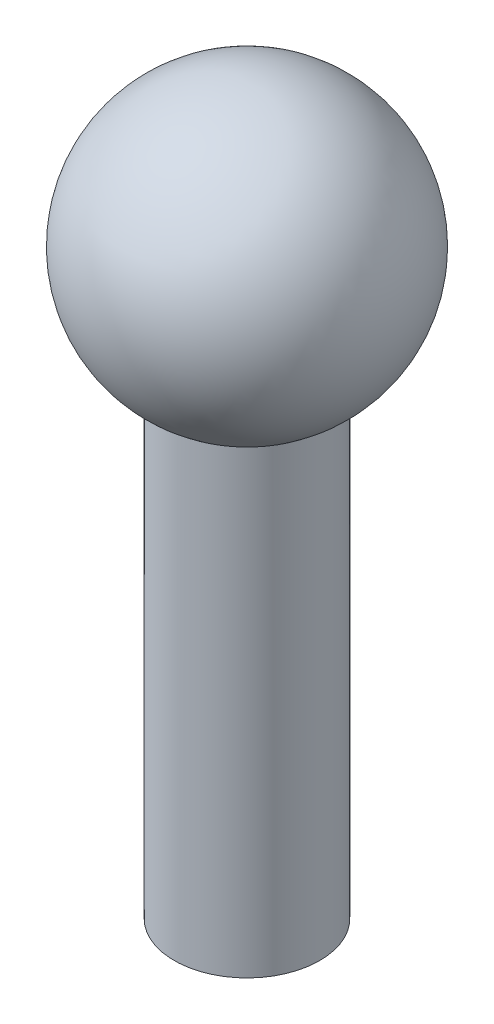
ISO-10303-21;
HEADER;
FILE_DESCRIPTION(('STEP AP214'),'2;1');
FILE_NAME('part.step','',(''),(''),'','','');
FILE_SCHEMA(('AUTOMOTIVE_DESIGN { 1 0 10303 214 1 1 1 1 }'));
ENDSEC;
DATA;
#1=APPLICATION_CONTEXT('core data for automotive mechanical design processes');
#2=APPLICATION_PROTOCOL_DEFINITION('international standard','automotive_design',2000,#1);
#3=PRODUCT_CONTEXT('',#1,'mechanical');
#4=PRODUCT('Part','Part','',(#3));
#5=PRODUCT_RELATED_PRODUCT_CATEGORY('part','',(#4));
#6=PRODUCT_DEFINITION_FORMATION('','',#4);
#7=PRODUCT_DEFINITION_CONTEXT('part definition',#1,'design');
#8=PRODUCT_DEFINITION('design','',#6,#7);
#9=PRODUCT_DEFINITION_SHAPE('','',#8);
#10=(LENGTH_UNIT() NAMED_UNIT(*) SI_UNIT(.MILLI.,.METRE.));
#11=(NAMED_UNIT(*) PLANE_ANGLE_UNIT() SI_UNIT($,.RADIAN.));
#12=(NAMED_UNIT(*) SI_UNIT($,.STERADIAN.) SOLID_ANGLE_UNIT());
#13=UNCERTAINTY_MEASURE_WITH_UNIT(LENGTH_MEASURE(1.E-05),#10,'distance_accuracy_value','');
#14=(GEOMETRIC_REPRESENTATION_CONTEXT(3) GLOBAL_UNCERTAINTY_ASSIGNED_CONTEXT((#13)) GLOBAL_UNIT_ASSIGNED_CONTEXT((#10,
#11,#12)) REPRESENTATION_CONTEXT('',''));
#15=CARTESIAN_POINT('',(0.,0.,0.));
#16=DIRECTION('',(0.,0.,1.));
#17=DIRECTION('',(1.,0.,0.));
#18=AXIS2_PLACEMENT_3D('',#15,#16,#17);
#19=CARTESIAN_POINT('',(0.,16.,0.));
#20=DIRECTION('',(0.,-1.,0.));
#21=DIRECTION('',(-1.,0.,0.));
#22=AXIS2_PLACEMENT_3D('',#19,#20,#21);
#23=SPHERICAL_SURFACE('',#22,3.9);
#24=CARTESIAN_POINT('',(0.,12.6518661914434,0.));
#25=DIRECTION('',(0.,-1.,0.));
#26=DIRECTION('',(0.,0.,-1.));
#27=AXIS2_PLACEMENT_3D('',#24,#25,#26);
#28=CIRCLE('',#27,2.);
#29=CARTESIAN_POINT('',(0.,12.6518661914434,-2.));
#30=VERTEX_POINT('',#29);
#31=EDGE_CURVE('E10',#30,#30,#28,.T.);
#32=ORIENTED_EDGE('',*,*,#31,.F.);
#33=EDGE_LOOP('',(#32));
#34=FACE_BOUND('',#33,.T.);
#35=ADVANCED_FACE('F42',(#34),#23,.T.);
#36=CARTESIAN_POINT('',(0.,0.,0.));
#37=DIRECTION('',(0.,-1.,0.));
#38=DIRECTION('',(0.,0.,-1.));
#39=AXIS2_PLACEMENT_3D('',#36,#37,#38);
#40=CYLINDRICAL_SURFACE('',#39,2.);
#41=ORIENTED_EDGE('',*,*,#31,.T.);
#42=EDGE_LOOP('',(#41));
#43=FACE_BOUND('',#42,.T.);
#44=CARTESIAN_POINT('',(0.,0.,0.));
#45=DIRECTION('',(0.,-1.,0.));
#46=DIRECTION('',(0.,0.,-1.));
#47=AXIS2_PLACEMENT_3D('',#44,#45,#46);
#48=CIRCLE('',#47,2.);
#49=CARTESIAN_POINT('',(0.,0.,-2.));
#50=VERTEX_POINT('',#49);
#51=EDGE_CURVE('E48',#50,#50,#48,.T.);
#52=ORIENTED_EDGE('',*,*,#51,.F.);
#53=EDGE_LOOP('',(#52));
#54=FACE_BOUND('',#53,.T.);
#55=ADVANCED_FACE('F56',(#43,#54),#40,.T.);
#56=CARTESIAN_POINT('',(0.,0.,0.));
#57=DIRECTION('',(0.,-1.,0.));
#58=DIRECTION('',(0.,0.,-1.));
#59=AXIS2_PLACEMENT_3D('',#56,#57,#58);
#60=PLANE('',#59);
#61=ORIENTED_EDGE('',*,*,#51,.T.);
#62=EDGE_LOOP('',(#61));
#63=FACE_BOUND('',#62,.T.);
#64=ADVANCED_FACE('F54',(#63),#60,.T.);
#65=CLOSED_SHELL('',(#35,#55,#64));
#66=MANIFOLD_SOLID_BREP('B2',#65);
#67=ADVANCED_BREP_SHAPE_REPRESENTATION('',(#18,#66),#14);
#68=SHAPE_DEFINITION_REPRESENTATION(#9,#67);
ENDSEC;
END-ISO-10303-21;
